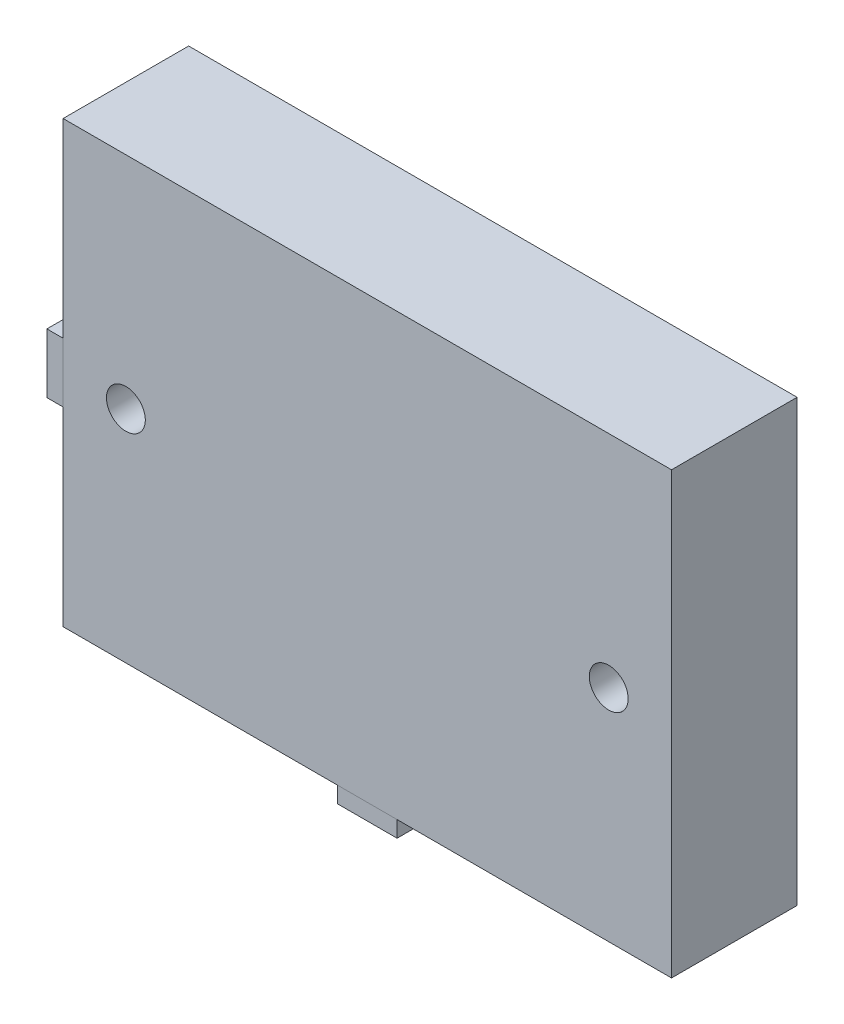
ISO-10303-21;
HEADER;
FILE_DESCRIPTION(('STEP AP214'),'2;1');
FILE_NAME('part.step','',(''),(''),'','','');
FILE_SCHEMA(('AUTOMOTIVE_DESIGN { 1 0 10303 214 1 1 1 1 }'));
ENDSEC;
DATA;
#1=APPLICATION_CONTEXT('core data for automotive mechanical design processes');
#2=APPLICATION_PROTOCOL_DEFINITION('international standard','automotive_design',2000,#1);
#3=PRODUCT_CONTEXT('',#1,'mechanical');
#4=PRODUCT('Part','Part','',(#3));
#5=PRODUCT_RELATED_PRODUCT_CATEGORY('part','',(#4));
#6=PRODUCT_DEFINITION_FORMATION('','',#4);
#7=PRODUCT_DEFINITION_CONTEXT('part definition',#1,'design');
#8=PRODUCT_DEFINITION('design','',#6,#7);
#9=PRODUCT_DEFINITION_SHAPE('','',#8);
#10=(LENGTH_UNIT() NAMED_UNIT(*) SI_UNIT(.MILLI.,.METRE.));
#11=(NAMED_UNIT(*) PLANE_ANGLE_UNIT() SI_UNIT($,.RADIAN.));
#12=(NAMED_UNIT(*) SI_UNIT($,.STERADIAN.) SOLID_ANGLE_UNIT());
#13=UNCERTAINTY_MEASURE_WITH_UNIT(LENGTH_MEASURE(1.E-05),#10,'distance_accuracy_value','');
#14=(GEOMETRIC_REPRESENTATION_CONTEXT(3) GLOBAL_UNCERTAINTY_ASSIGNED_CONTEXT((#13)) GLOBAL_UNIT_ASSIGNED_CONTEXT((#10,
#11,#12)) REPRESENTATION_CONTEXT('',''));
#15=CARTESIAN_POINT('',(0.,0.,0.));
#16=DIRECTION('',(0.,0.,1.));
#17=DIRECTION('',(1.,0.,0.));
#18=AXIS2_PLACEMENT_3D('',#15,#16,#17);
#19=CARTESIAN_POINT('',(21.2,-1.25,0.));
#20=DIRECTION('',(-1.,0.,0.));
#21=DIRECTION('',(0.,0.,1.));
#22=AXIS2_PLACEMENT_3D('',#19,#20,#21);
#23=PLANE('',#22);
#24=DIRECTION('',(0.,-1.,0.));
#25=VECTOR('',#24,1.);
#26=CARTESIAN_POINT('',(21.2,-1.25,9.7));
#27=LINE('',#26,#25);
#28=CARTESIAN_POINT('',(21.2,0.,9.7));
#29=VERTEX_POINT('',#28);
#30=CARTESIAN_POINT('',(21.2,-1.25,9.7));
#31=VERTEX_POINT('',#30);
#32=EDGE_CURVE('E127',#29,#31,#27,.T.);
#33=ORIENTED_EDGE('',*,*,#32,.F.);
#34=DIRECTION('',(0.,0.,1.));
#35=VECTOR('',#34,1.);
#36=CARTESIAN_POINT('',(21.2,0.,0.));
#37=LINE('',#36,#35);
#38=CARTESIAN_POINT('',(21.2,0.,0.));
#39=VERTEX_POINT('',#38);
#40=EDGE_CURVE('E12',#39,#29,#37,.T.);
#41=ORIENTED_EDGE('',*,*,#40,.F.);
#42=DIRECTION('',(0.,-1.,0.));
#43=VECTOR('',#42,1.);
#44=CARTESIAN_POINT('',(21.2,-1.25,0.));
#45=LINE('',#44,#43);
#46=CARTESIAN_POINT('',(21.2,-1.25,0.));
#47=VERTEX_POINT('',#46);
#48=EDGE_CURVE('E119',#39,#47,#45,.T.);
#49=ORIENTED_EDGE('',*,*,#48,.T.);
#50=DIRECTION('',(0.,0.,1.));
#51=VECTOR('',#50,1.);
#52=CARTESIAN_POINT('',(21.2,-1.25,0.));
#53=LINE('',#52,#51);
#54=EDGE_CURVE('E52',#47,#31,#53,.T.);
#55=ORIENTED_EDGE('',*,*,#54,.T.);
#56=EDGE_LOOP('',(#33,#41,#49,#55));
#57=FACE_BOUND('',#56,.T.);
#58=ADVANCED_FACE('F49',(#57),#23,.T.);
#59=CARTESIAN_POINT('',(25.8,0.,0.));
#60=DIRECTION('',(0.,1.,0.));
#61=DIRECTION('',(0.,0.,1.));
#62=AXIS2_PLACEMENT_3D('',#59,#60,#61);
#63=PLANE('',#62);
#64=DIRECTION('',(-1.,0.,0.));
#65=VECTOR('',#64,1.);
#66=CARTESIAN_POINT('',(25.8,0.,9.7));
#67=LINE('',#66,#65);
#68=CARTESIAN_POINT('',(25.8,0.,9.7));
#69=VERTEX_POINT('',#68);
#70=EDGE_CURVE('E122',#69,#29,#67,.T.);
#71=ORIENTED_EDGE('',*,*,#70,.F.);
#72=DIRECTION('',(0.,0.,1.));
#73=VECTOR('',#72,1.);
#74=CARTESIAN_POINT('',(25.8,0.,0.));
#75=LINE('',#74,#73);
#76=CARTESIAN_POINT('',(25.8,0.,0.));
#77=VERTEX_POINT('',#76);
#78=EDGE_CURVE('E59',#77,#69,#75,.T.);
#79=ORIENTED_EDGE('',*,*,#78,.F.);
#80=DIRECTION('',(-1.,0.,0.));
#81=VECTOR('',#80,1.);
#82=CARTESIAN_POINT('',(25.8,0.,0.));
#83=LINE('',#82,#81);
#84=EDGE_CURVE('E114',#77,#39,#83,.T.);
#85=ORIENTED_EDGE('',*,*,#84,.T.);
#86=ORIENTED_EDGE('',*,*,#40,.T.);
#87=EDGE_LOOP('',(#71,#79,#85,#86));
#88=FACE_BOUND('',#87,.T.);
#89=ADVANCED_FACE('F143',(#88),#63,.T.);
#90=CARTESIAN_POINT('',(25.8,-1.25,0.));
#91=DIRECTION('',(1.,0.,0.));
#92=DIRECTION('',(0.,0.,-1.));
#93=AXIS2_PLACEMENT_3D('',#90,#91,#92);
#94=PLANE('',#93);
#95=DIRECTION('',(0.,1.,0.));
#96=VECTOR('',#95,1.);
#97=CARTESIAN_POINT('',(25.8,-1.25,9.7));
#98=LINE('',#97,#96);
#99=CARTESIAN_POINT('',(25.8,-1.25,9.7));
#100=VERTEX_POINT('',#99);
#101=EDGE_CURVE('E108',#100,#69,#98,.T.);
#102=ORIENTED_EDGE('',*,*,#101,.F.);
#103=DIRECTION('',(0.,0.,1.));
#104=VECTOR('',#103,1.);
#105=CARTESIAN_POINT('',(25.8,-1.25,0.));
#106=LINE('',#105,#104);
#107=CARTESIAN_POINT('',(25.8,-1.25,0.));
#108=VERTEX_POINT('',#107);
#109=EDGE_CURVE('E103',#108,#100,#106,.T.);
#110=ORIENTED_EDGE('',*,*,#109,.F.);
#111=DIRECTION('',(0.,1.,0.));
#112=VECTOR('',#111,1.);
#113=CARTESIAN_POINT('',(25.8,-1.25,0.));
#114=LINE('',#113,#112);
#115=EDGE_CURVE('E106',#108,#77,#114,.T.);
#116=ORIENTED_EDGE('',*,*,#115,.T.);
#117=ORIENTED_EDGE('',*,*,#78,.T.);
#118=EDGE_LOOP('',(#102,#110,#116,#117));
#119=FACE_BOUND('',#118,.T.);
#120=ADVANCED_FACE('F105',(#119),#94,.T.);
#121=CARTESIAN_POINT('',(21.2,-1.25,0.));
#122=DIRECTION('',(0.,-1.,0.));
#123=DIRECTION('',(0.,0.,-1.));
#124=AXIS2_PLACEMENT_3D('',#121,#122,#123);
#125=PLANE('',#124);
#126=DIRECTION('',(1.,0.,0.));
#127=VECTOR('',#126,1.);
#128=CARTESIAN_POINT('',(21.2,-1.25,9.7));
#129=LINE('',#128,#127);
#130=EDGE_CURVE('E131',#31,#100,#129,.T.);
#131=ORIENTED_EDGE('',*,*,#130,.F.);
#132=ORIENTED_EDGE('',*,*,#54,.F.);
#133=DIRECTION('',(1.,0.,0.));
#134=VECTOR('',#133,1.);
#135=CARTESIAN_POINT('',(21.2,-1.25,0.));
#136=LINE('',#135,#134);
#137=EDGE_CURVE('E113',#47,#108,#136,.T.);
#138=ORIENTED_EDGE('',*,*,#137,.T.);
#139=ORIENTED_EDGE('',*,*,#109,.T.);
#140=EDGE_LOOP('',(#131,#132,#138,#139));
#141=FACE_BOUND('',#140,.T.);
#142=ADVANCED_FACE('F117',(#141),#125,.T.);
#143=CARTESIAN_POINT('',(0.,0.,0.));
#144=DIRECTION('',(0.,0.,1.));
#145=DIRECTION('',(1.,0.,0.));
#146=AXIS2_PLACEMENT_3D('',#143,#144,#145);
#147=PLANE('',#146);
#148=ORIENTED_EDGE('',*,*,#48,.F.);
#149=ORIENTED_EDGE('',*,*,#84,.F.);
#150=ORIENTED_EDGE('',*,*,#115,.F.);
#151=ORIENTED_EDGE('',*,*,#137,.F.);
#152=EDGE_LOOP('',(#148,#149,#150,#151));
#153=FACE_BOUND('',#152,.T.);
#154=ADVANCED_FACE('F112',(#153),#147,.F.);
#155=CARTESIAN_POINT('',(0.,0.,9.7));
#156=DIRECTION('',(0.,0.,1.));
#157=DIRECTION('',(1.,0.,0.));
#158=AXIS2_PLACEMENT_3D('',#155,#156,#157);
#159=PLANE('',#158);
#160=ORIENTED_EDGE('',*,*,#32,.T.);
#161=ORIENTED_EDGE('',*,*,#130,.T.);
#162=ORIENTED_EDGE('',*,*,#101,.T.);
#163=ORIENTED_EDGE('',*,*,#70,.T.);
#164=EDGE_LOOP('',(#160,#161,#162,#163));
#165=FACE_BOUND('',#164,.T.);
#166=ADVANCED_FACE('F142',(#165),#159,.T.);
#167=CLOSED_SHELL('',(#58,#89,#120,#142,#154,#166));
#168=MANIFOLD_SOLID_BREP('B2',#167);
#169=CARTESIAN_POINT('',(0.,14.7,0.));
#170=DIRECTION('',(1.,0.,0.));
#171=DIRECTION('',(0.,0.,-1.));
#172=AXIS2_PLACEMENT_3D('',#169,#170,#171);
#173=PLANE('',#172);
#174=DIRECTION('',(0.,1.,0.));
#175=VECTOR('',#174,1.);
#176=CARTESIAN_POINT('',(0.,14.7,9.7));
#177=LINE('',#176,#175);
#178=CARTESIAN_POINT('',(0.,14.7,9.7));
#179=VERTEX_POINT('',#178);
#180=CARTESIAN_POINT('',(0.,19.3,9.7));
#181=VERTEX_POINT('',#180);
#182=EDGE_CURVE('E267',#179,#181,#177,.T.);
#183=ORIENTED_EDGE('',*,*,#182,.F.);
#184=DIRECTION('',(0.,0.,1.));
#185=VECTOR('',#184,1.);
#186=CARTESIAN_POINT('',(0.,14.7,0.));
#187=LINE('',#186,#185);
#188=CARTESIAN_POINT('',(0.,14.7,0.));
#189=VERTEX_POINT('',#188);
#190=EDGE_CURVE('E47',#189,#179,#187,.T.);
#191=ORIENTED_EDGE('',*,*,#190,.F.);
#192=DIRECTION('',(0.,1.,0.));
#193=VECTOR('',#192,1.);
#194=CARTESIAN_POINT('',(0.,14.7,0.));
#195=LINE('',#194,#193);
#196=CARTESIAN_POINT('',(0.,19.3,0.));
#197=VERTEX_POINT('',#196);
#198=EDGE_CURVE('E261',#189,#197,#195,.T.);
#199=ORIENTED_EDGE('',*,*,#198,.T.);
#200=DIRECTION('',(0.,0.,1.));
#201=VECTOR('',#200,1.);
#202=CARTESIAN_POINT('',(0.,19.3,0.));
#203=LINE('',#202,#201);
#204=EDGE_CURVE('E206',#197,#181,#203,.T.);
#205=ORIENTED_EDGE('',*,*,#204,.T.);
#206=EDGE_LOOP('',(#183,#191,#199,#205));
#207=FACE_BOUND('',#206,.T.);
#208=ADVANCED_FACE('F203',(#207),#173,.T.);
#209=CARTESIAN_POINT('',(0.,14.7,0.));
#210=DIRECTION('',(0.,-1.,0.));
#211=DIRECTION('',(0.,0.,-1.));
#212=AXIS2_PLACEMENT_3D('',#209,#210,#211);
#213=PLANE('',#212);
#214=DIRECTION('',(1.,0.,0.));
#215=VECTOR('',#214,1.);
#216=CARTESIAN_POINT('',(0.,14.7,9.7));
#217=LINE('',#216,#215);
#218=CARTESIAN_POINT('',(-1.25,14.7,9.7));
#219=VERTEX_POINT('',#218);
#220=EDGE_CURVE('E263',#219,#179,#217,.T.);
#221=ORIENTED_EDGE('',*,*,#220,.F.);
#222=DIRECTION('',(0.,0.,1.));
#223=VECTOR('',#222,1.);
#224=CARTESIAN_POINT('',(-1.25,14.7,0.));
#225=LINE('',#224,#223);
#226=CARTESIAN_POINT('',(-1.25,14.7,0.));
#227=VERTEX_POINT('',#226);
#228=EDGE_CURVE('E212',#227,#219,#225,.T.);
#229=ORIENTED_EDGE('',*,*,#228,.F.);
#230=DIRECTION('',(1.,0.,0.));
#231=VECTOR('',#230,1.);
#232=CARTESIAN_POINT('',(0.,14.7,0.));
#233=LINE('',#232,#231);
#234=EDGE_CURVE('E258',#227,#189,#233,.T.);
#235=ORIENTED_EDGE('',*,*,#234,.T.);
#236=ORIENTED_EDGE('',*,*,#190,.T.);
#237=EDGE_LOOP('',(#221,#229,#235,#236));
#238=FACE_BOUND('',#237,.T.);
#239=ADVANCED_FACE('F277',(#238),#213,.T.);
#240=CARTESIAN_POINT('',(-1.25,14.7,0.));
#241=DIRECTION('',(-1.,0.,0.));
#242=DIRECTION('',(0.,0.,1.));
#243=AXIS2_PLACEMENT_3D('',#240,#241,#242);
#244=PLANE('',#243);
#245=DIRECTION('',(0.,-1.,0.));
#246=VECTOR('',#245,1.);
#247=CARTESIAN_POINT('',(-1.25,14.7,9.7));
#248=LINE('',#247,#246);
#249=CARTESIAN_POINT('',(-1.25,19.3,9.7));
#250=VERTEX_POINT('',#249);
#251=EDGE_CURVE('E253',#250,#219,#248,.T.);
#252=ORIENTED_EDGE('',*,*,#251,.F.);
#253=DIRECTION('',(0.,0.,1.));
#254=VECTOR('',#253,1.);
#255=CARTESIAN_POINT('',(-1.25,19.3,0.));
#256=LINE('',#255,#254);
#257=CARTESIAN_POINT('',(-1.25,19.3,0.));
#258=VERTEX_POINT('',#257);
#259=EDGE_CURVE('E248',#258,#250,#256,.T.);
#260=ORIENTED_EDGE('',*,*,#259,.F.);
#261=DIRECTION('',(0.,-1.,0.));
#262=VECTOR('',#261,1.);
#263=CARTESIAN_POINT('',(-1.25,14.7,0.));
#264=LINE('',#263,#262);
#265=EDGE_CURVE('E251',#258,#227,#264,.T.);
#266=ORIENTED_EDGE('',*,*,#265,.T.);
#267=ORIENTED_EDGE('',*,*,#228,.T.);
#268=EDGE_LOOP('',(#252,#260,#266,#267));
#269=FACE_BOUND('',#268,.T.);
#270=ADVANCED_FACE('F250',(#269),#244,.T.);
#271=CARTESIAN_POINT('',(0.,19.3,0.));
#272=DIRECTION('',(0.,1.,0.));
#273=DIRECTION('',(0.,0.,1.));
#274=AXIS2_PLACEMENT_3D('',#271,#272,#273);
#275=PLANE('',#274);
#276=DIRECTION('',(-1.,0.,0.));
#277=VECTOR('',#276,1.);
#278=CARTESIAN_POINT('',(0.,19.3,9.7));
#279=LINE('',#278,#277);
#280=EDGE_CURVE('E270',#181,#250,#279,.T.);
#281=ORIENTED_EDGE('',*,*,#280,.F.);
#282=ORIENTED_EDGE('',*,*,#204,.F.);
#283=DIRECTION('',(-1.,0.,0.));
#284=VECTOR('',#283,1.);
#285=CARTESIAN_POINT('',(0.,19.3,0.));
#286=LINE('',#285,#284);
#287=EDGE_CURVE('E257',#197,#258,#286,.T.);
#288=ORIENTED_EDGE('',*,*,#287,.T.);
#289=ORIENTED_EDGE('',*,*,#259,.T.);
#290=EDGE_LOOP('',(#281,#282,#288,#289));
#291=FACE_BOUND('',#290,.T.);
#292=ADVANCED_FACE('F260',(#291),#275,.T.);
#293=CARTESIAN_POINT('',(0.,0.,0.));
#294=DIRECTION('',(0.,0.,1.));
#295=DIRECTION('',(1.,0.,0.));
#296=AXIS2_PLACEMENT_3D('',#293,#294,#295);
#297=PLANE('',#296);
#298=ORIENTED_EDGE('',*,*,#198,.F.);
#299=ORIENTED_EDGE('',*,*,#234,.F.);
#300=ORIENTED_EDGE('',*,*,#265,.F.);
#301=ORIENTED_EDGE('',*,*,#287,.F.);
#302=EDGE_LOOP('',(#298,#299,#300,#301));
#303=FACE_BOUND('',#302,.T.);
#304=ADVANCED_FACE('F256',(#303),#297,.F.);
#305=CARTESIAN_POINT('',(0.,0.,9.7));
#306=DIRECTION('',(0.,0.,1.));
#307=DIRECTION('',(1.,0.,0.));
#308=AXIS2_PLACEMENT_3D('',#305,#306,#307);
#309=PLANE('',#308);
#310=ORIENTED_EDGE('',*,*,#182,.T.);
#311=ORIENTED_EDGE('',*,*,#280,.T.);
#312=ORIENTED_EDGE('',*,*,#251,.T.);
#313=ORIENTED_EDGE('',*,*,#220,.T.);
#314=EDGE_LOOP('',(#310,#311,#312,#313));
#315=FACE_BOUND('',#314,.T.);
#316=ADVANCED_FACE('F276',(#315),#309,.T.);
#317=CLOSED_SHELL('',(#208,#239,#270,#292,#304,#316));
#318=MANIFOLD_SOLID_BREP('B6',#317);
#319=CARTESIAN_POINT('',(0.,0.,9.7));
#320=DIRECTION('',(1.,0.,0.));
#321=DIRECTION('',(0.,1.,0.));
#322=AXIS2_PLACEMENT_3D('',#319,#320,#321);
#323=PLANE('',#322);
#324=DIRECTION('',(0.,-1.,0.));
#325=VECTOR('',#324,1.);
#326=CARTESIAN_POINT('',(0.,0.,0.));
#327=LINE('',#326,#325);
#328=CARTESIAN_POINT('',(0.,34.,0.));
#329=VERTEX_POINT('',#328);
#330=CARTESIAN_POINT('',(0.,0.,0.));
#331=VERTEX_POINT('',#330);
#332=EDGE_CURVE('E398',#329,#331,#327,.T.);
#333=ORIENTED_EDGE('',*,*,#332,.T.);
#334=DIRECTION('',(0.,0.,-1.));
#335=VECTOR('',#334,1.);
#336=CARTESIAN_POINT('',(0.,0.,9.7));
#337=LINE('',#336,#335);
#338=CARTESIAN_POINT('',(0.,0.,9.7));
#339=VERTEX_POINT('',#338);
#340=EDGE_CURVE('E201',#339,#331,#337,.T.);
#341=ORIENTED_EDGE('',*,*,#340,.F.);
#342=DIRECTION('',(0.,-1.,0.));
#343=VECTOR('',#342,1.);
#344=CARTESIAN_POINT('',(0.,0.,9.7));
#345=LINE('',#344,#343);
#346=CARTESIAN_POINT('',(0.,34.,9.7));
#347=VERTEX_POINT('',#346);
#348=EDGE_CURVE('E383',#347,#339,#345,.T.);
#349=ORIENTED_EDGE('',*,*,#348,.F.);
#350=DIRECTION('',(0.,0.,-1.));
#351=VECTOR('',#350,1.);
#352=CARTESIAN_POINT('',(0.,34.,9.7));
#353=LINE('',#352,#351);
#354=EDGE_CURVE('E394',#347,#329,#353,.T.);
#355=ORIENTED_EDGE('',*,*,#354,.T.);
#356=EDGE_LOOP('',(#333,#341,#349,#355));
#357=FACE_BOUND('',#356,.T.);
#358=ADVANCED_FACE('F326',(#357),#323,.F.);
#359=CARTESIAN_POINT('',(0.,0.,9.7));
#360=DIRECTION('',(0.,1.,0.));
#361=DIRECTION('',(0.,0.,1.));
#362=AXIS2_PLACEMENT_3D('',#359,#360,#361);
#363=PLANE('',#362);
#364=DIRECTION('',(1.,0.,0.));
#365=VECTOR('',#364,1.);
#366=CARTESIAN_POINT('',(0.,0.,0.));
#367=LINE('',#366,#365);
#368=CARTESIAN_POINT('',(47.,0.,0.));
#369=VERTEX_POINT('',#368);
#370=EDGE_CURVE('E388',#331,#369,#367,.T.);
#371=ORIENTED_EDGE('',*,*,#370,.T.);
#372=DIRECTION('',(0.,0.,-1.));
#373=VECTOR('',#372,1.);
#374=CARTESIAN_POINT('',(47.,0.,9.7));
#375=LINE('',#374,#373);
#376=CARTESIAN_POINT('',(47.,0.,9.7));
#377=VERTEX_POINT('',#376);
#378=EDGE_CURVE('E335',#377,#369,#375,.T.);
#379=ORIENTED_EDGE('',*,*,#378,.F.);
#380=DIRECTION('',(1.,0.,0.));
#381=VECTOR('',#380,1.);
#382=CARTESIAN_POINT('',(0.,0.,9.7));
#383=LINE('',#382,#381);
#384=EDGE_CURVE('E378',#339,#377,#383,.T.);
#385=ORIENTED_EDGE('',*,*,#384,.F.);
#386=ORIENTED_EDGE('',*,*,#340,.T.);
#387=EDGE_LOOP('',(#371,#379,#385,#386));
#388=FACE_BOUND('',#387,.T.);
#389=ADVANCED_FACE('F387',(#388),#363,.F.);
#390=CARTESIAN_POINT('',(47.,0.,9.7));
#391=DIRECTION('',(-1.,0.,0.));
#392=DIRECTION('',(0.,-1.,0.));
#393=AXIS2_PLACEMENT_3D('',#390,#391,#392);
#394=PLANE('',#393);
#395=DIRECTION('',(0.,1.,0.));
#396=VECTOR('',#395,1.);
#397=CARTESIAN_POINT('',(47.,0.,0.));
#398=LINE('',#397,#396);
#399=CARTESIAN_POINT('',(47.,34.,0.));
#400=VERTEX_POINT('',#399);
#401=EDGE_CURVE('E364',#369,#400,#398,.T.);
#402=ORIENTED_EDGE('',*,*,#401,.T.);
#403=DIRECTION('',(0.,0.,-1.));
#404=VECTOR('',#403,1.);
#405=CARTESIAN_POINT('',(47.,34.,9.7));
#406=LINE('',#405,#404);
#407=CARTESIAN_POINT('',(47.,34.,9.7));
#408=VERTEX_POINT('',#407);
#409=EDGE_CURVE('E390',#408,#400,#406,.T.);
#410=ORIENTED_EDGE('',*,*,#409,.F.);
#411=DIRECTION('',(0.,1.,0.));
#412=VECTOR('',#411,1.);
#413=CARTESIAN_POINT('',(47.,0.,9.7));
#414=LINE('',#413,#412);
#415=EDGE_CURVE('E381',#377,#408,#414,.T.);
#416=ORIENTED_EDGE('',*,*,#415,.F.);
#417=ORIENTED_EDGE('',*,*,#378,.T.);
#418=EDGE_LOOP('',(#402,#410,#416,#417));
#419=FACE_BOUND('',#418,.T.);
#420=ADVANCED_FACE('F391',(#419),#394,.F.);
#421=CARTESIAN_POINT('',(0.,34.,9.7));
#422=DIRECTION('',(0.,-1.,0.));
#423=DIRECTION('',(0.,0.,-1.));
#424=AXIS2_PLACEMENT_3D('',#421,#422,#423);
#425=PLANE('',#424);
#426=DIRECTION('',(-1.,0.,0.));
#427=VECTOR('',#426,1.);
#428=CARTESIAN_POINT('',(0.,34.,0.));
#429=LINE('',#428,#427);
#430=EDGE_CURVE('E370',#400,#329,#429,.T.);
#431=ORIENTED_EDGE('',*,*,#430,.T.);
#432=ORIENTED_EDGE('',*,*,#354,.F.);
#433=DIRECTION('',(-1.,0.,0.));
#434=VECTOR('',#433,1.);
#435=CARTESIAN_POINT('',(0.,34.,9.7));
#436=LINE('',#435,#434);
#437=EDGE_CURVE('E345',#408,#347,#436,.T.);
#438=ORIENTED_EDGE('',*,*,#437,.F.);
#439=ORIENTED_EDGE('',*,*,#409,.T.);
#440=EDGE_LOOP('',(#431,#432,#438,#439));
#441=FACE_BOUND('',#440,.T.);
#442=ADVANCED_FACE('F411',(#441),#425,.F.);
#443=CARTESIAN_POINT('',(0.,0.,9.7));
#444=DIRECTION('',(0.,0.,-1.));
#445=DIRECTION('',(-1.,0.,0.));
#446=AXIS2_PLACEMENT_3D('',#443,#444,#445);
#447=PLANE('',#446);
#448=CARTESIAN_POINT('',(4.85000000000001,17.,9.7));
#449=DIRECTION('',(0.,0.,1.));
#450=DIRECTION('',(-1.,0.,0.));
#451=AXIS2_PLACEMENT_3D('',#448,#449,#450);
#452=CIRCLE('',#451,1.5);
#453=CARTESIAN_POINT('',(3.35000000000001,17.,9.7));
#454=VERTEX_POINT('',#453);
#455=EDGE_CURVE('E425',#454,#454,#452,.T.);
#456=ORIENTED_EDGE('',*,*,#455,.F.);
#457=EDGE_LOOP('',(#456));
#458=FACE_BOUND('',#457,.T.);
#459=CARTESIAN_POINT('',(42.15,17.,9.7));
#460=DIRECTION('',(0.,0.,1.));
#461=DIRECTION('',(1.,0.,0.));
#462=AXIS2_PLACEMENT_3D('',#459,#460,#461);
#463=CIRCLE('',#462,1.5);
#464=CARTESIAN_POINT('',(43.65,17.,9.7));
#465=VERTEX_POINT('',#464);
#466=EDGE_CURVE('E418',#465,#465,#463,.T.);
#467=ORIENTED_EDGE('',*,*,#466,.F.);
#468=EDGE_LOOP('',(#467));
#469=FACE_BOUND('',#468,.T.);
#470=ORIENTED_EDGE('',*,*,#348,.T.);
#471=ORIENTED_EDGE('',*,*,#384,.T.);
#472=ORIENTED_EDGE('',*,*,#415,.T.);
#473=ORIENTED_EDGE('',*,*,#437,.T.);
#474=EDGE_LOOP('',(#470,#471,#472,#473));
#475=FACE_BOUND('',#474,.T.);
#476=ADVANCED_FACE('F379',(#458,#469,#475),#447,.F.);
#477=CARTESIAN_POINT('',(0.,0.,0.));
#478=DIRECTION('',(0.,0.,-1.));
#479=DIRECTION('',(-1.,0.,0.));
#480=AXIS2_PLACEMENT_3D('',#477,#478,#479);
#481=PLANE('',#480);
#482=CARTESIAN_POINT('',(4.85000000000001,17.,0.));
#483=DIRECTION('',(0.,0.,1.));
#484=DIRECTION('',(-1.,0.,0.));
#485=AXIS2_PLACEMENT_3D('',#482,#483,#484);
#486=CIRCLE('',#485,1.5);
#487=CARTESIAN_POINT('',(3.35000000000001,17.,0.));
#488=VERTEX_POINT('',#487);
#489=EDGE_CURVE('E421',#488,#488,#486,.T.);
#490=ORIENTED_EDGE('',*,*,#489,.T.);
#491=EDGE_LOOP('',(#490));
#492=FACE_BOUND('',#491,.T.);
#493=CARTESIAN_POINT('',(42.15,17.,0.));
#494=DIRECTION('',(0.,0.,1.));
#495=DIRECTION('',(1.,0.,0.));
#496=AXIS2_PLACEMENT_3D('',#493,#494,#495);
#497=CIRCLE('',#496,1.5);
#498=CARTESIAN_POINT('',(43.65,17.,0.));
#499=VERTEX_POINT('',#498);
#500=EDGE_CURVE('E402',#499,#499,#497,.T.);
#501=ORIENTED_EDGE('',*,*,#500,.T.);
#502=EDGE_LOOP('',(#501));
#503=FACE_BOUND('',#502,.T.);
#504=ORIENTED_EDGE('',*,*,#332,.F.);
#505=ORIENTED_EDGE('',*,*,#430,.F.);
#506=ORIENTED_EDGE('',*,*,#401,.F.);
#507=ORIENTED_EDGE('',*,*,#370,.F.);
#508=EDGE_LOOP('',(#504,#505,#506,#507));
#509=FACE_BOUND('',#508,.T.);
#510=ADVANCED_FACE('F414',(#492,#503,#509),#481,.T.);
#511=CARTESIAN_POINT('',(42.15,17.,0.));
#512=DIRECTION('',(0.,0.,1.));
#513=DIRECTION('',(1.,0.,0.));
#514=AXIS2_PLACEMENT_3D('',#511,#512,#513);
#515=CYLINDRICAL_SURFACE('',#514,1.5);
#516=ORIENTED_EDGE('',*,*,#500,.F.);
#517=EDGE_LOOP('',(#516));
#518=FACE_BOUND('',#517,.T.);
#519=ORIENTED_EDGE('',*,*,#466,.T.);
#520=EDGE_LOOP('',(#519));
#521=FACE_BOUND('',#520,.T.);
#522=ADVANCED_FACE('F436',(#518,#521),#515,.F.);
#523=CARTESIAN_POINT('',(4.85000000000001,17.,0.));
#524=DIRECTION('',(0.,0.,1.));
#525=DIRECTION('',(1.,0.,0.));
#526=AXIS2_PLACEMENT_3D('',#523,#524,#525);
#527=CYLINDRICAL_SURFACE('',#526,1.5);
#528=ORIENTED_EDGE('',*,*,#489,.F.);
#529=EDGE_LOOP('',(#528));
#530=FACE_BOUND('',#529,.T.);
#531=ORIENTED_EDGE('',*,*,#455,.T.);
#532=EDGE_LOOP('',(#531));
#533=FACE_BOUND('',#532,.T.);
#534=ADVANCED_FACE('F433',(#530,#533),#527,.F.);
#535=CLOSED_SHELL('',(#358,#389,#420,#442,#476,#510,#522,#534));
#536=MANIFOLD_SOLID_BREP('B41',#535);
#537=ADVANCED_BREP_SHAPE_REPRESENTATION('',(#18,#168,#318,#536),#14);
#538=SHAPE_DEFINITION_REPRESENTATION(#9,#537);
ENDSEC;
END-ISO-10303-21;
